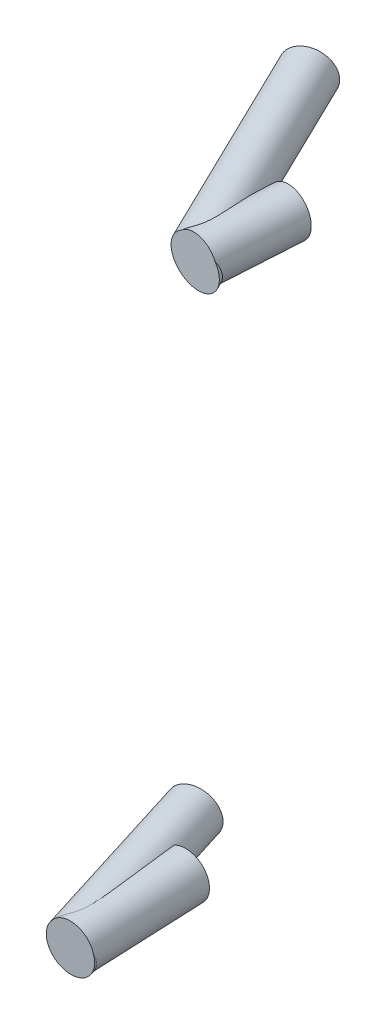
ISO-10303-21;
HEADER;
FILE_DESCRIPTION(('STEP AP214'),'2;1');
FILE_NAME('part.step','',(''),(''),'','','');
FILE_SCHEMA(('AUTOMOTIVE_DESIGN { 1 0 10303 214 1 1 1 1 }'));
ENDSEC;
DATA;
#1=APPLICATION_CONTEXT('core data for automotive mechanical design processes');
#2=APPLICATION_PROTOCOL_DEFINITION('international standard','automotive_design',2000,#1);
#3=PRODUCT_CONTEXT('',#1,'mechanical');
#4=PRODUCT('Part','Part','',(#3));
#5=PRODUCT_RELATED_PRODUCT_CATEGORY('part','',(#4));
#6=PRODUCT_DEFINITION_FORMATION('','',#4);
#7=PRODUCT_DEFINITION_CONTEXT('part definition',#1,'design');
#8=PRODUCT_DEFINITION('design','',#6,#7);
#9=PRODUCT_DEFINITION_SHAPE('','',#8);
#10=(LENGTH_UNIT() NAMED_UNIT(*) SI_UNIT(.MILLI.,.METRE.));
#11=(NAMED_UNIT(*) PLANE_ANGLE_UNIT() SI_UNIT($,.RADIAN.));
#12=(NAMED_UNIT(*) SI_UNIT($,.STERADIAN.) SOLID_ANGLE_UNIT());
#13=UNCERTAINTY_MEASURE_WITH_UNIT(LENGTH_MEASURE(1.E-05),#10,'distance_accuracy_value','');
#14=(GEOMETRIC_REPRESENTATION_CONTEXT(3) GLOBAL_UNCERTAINTY_ASSIGNED_CONTEXT((#13)) GLOBAL_UNIT_ASSIGNED_CONTEXT((#10,
#11,#12)) REPRESENTATION_CONTEXT('',''));
#15=CARTESIAN_POINT('',(0.,0.,0.));
#16=DIRECTION('',(0.,0.,1.));
#17=DIRECTION('',(1.,0.,0.));
#18=AXIS2_PLACEMENT_3D('',#15,#16,#17);
#19=CARTESIAN_POINT('',(-320.393147,904.551348,-269.719394));
#20=DIRECTION('',(-0.0159019479525123,0.028637862758801,-0.999463356440807));
#21=DIRECTION('',(0.,0.999589748535364,0.0286414843017364));
#22=AXIS2_PLACEMENT_3D('',#19,#20,#21);
#23=PLANE('',#22);
#24=CARTESIAN_POINT('',(-320.393147,904.551348,-269.719394));
#25=DIRECTION('',(-0.0159019479525123,0.028637862758801,-0.999463356440807));
#26=DIRECTION('',(0.,0.999589748535364,0.0286414843017364));
#27=AXIS2_PLACEMENT_3D('',#24,#25,#26);
#28=CIRCLE('',#27,6.99999999999999);
#29=CARTESIAN_POINT('',(-325.891411369871,908.878514562351,-269.507926601397));
#30=VERTEX_POINT('',#29);
#31=CARTESIAN_POINT('',(-313.615616191755,906.301132907355,-269.777090804744));
#32=VERTEX_POINT('',#31);
#33=EDGE_CURVE('E107',#30,#32,#28,.T.);
#34=ORIENTED_EDGE('',*,*,#33,.F.);
#35=CARTESIAN_POINT('',(-320.463788052915,904.215779016331,-269.727885204904));
#36=DIRECTION('',(-0.0159019479525123,0.028637862758801,-0.999463356440807));
#37=DIRECTION('',(-0.978436853140769,0.205428982749971,0.02145361187077));
#38=AXIS2_PLACEMENT_3D('',#35,#36,#37);
#39=ELLIPSE('',#38,7.20898734497032,7.00000000000002);
#40=EDGE_CURVE('E118',#30,#32,#39,.F.);
#41=ORIENTED_EDGE('',*,*,#40,.T.);
#42=EDGE_LOOP('',(#34,#41));
#43=FACE_BOUND('',#42,.T.);
#44=ADVANCED_FACE('F77',(#43),#23,.F.);
#45=CARTESIAN_POINT('',(-320.956942,905.566688,-305.154829));
#46=DIRECTION('',(-0.0159019479525123,0.028637862758801,-0.999463356440807));
#47=DIRECTION('',(0.,0.999589748535364,0.0286414843017364));
#48=AXIS2_PLACEMENT_3D('',#45,#46,#47);
#49=PLANE('',#48);
#50=CARTESIAN_POINT('',(-329.567373473225,907.024101826934,-304.976073221569));
#51=DIRECTION('',(-0.0159019479525123,0.028637862758801,-0.999463356440807));
#52=DIRECTION('',(-0.978436853140769,0.205428982749971,0.02145361187077));
#53=AXIS2_PLACEMENT_3D('',#50,#51,#52);
#54=ELLIPSE('',#53,7.20898734497032,7.00000000000002);
#55=CARTESIAN_POINT('',(-324.282017233494,911.722279346482,-304.925547804242));
#56=VERTEX_POINT('',#55);
#57=CARTESIAN_POINT('',(-326.117200818743,900.837113418917,-305.208244405637));
#58=VERTEX_POINT('',#57);
#59=EDGE_CURVE('E102',#56,#58,#54,.T.);
#60=ORIENTED_EDGE('',*,*,#59,.F.);
#61=CARTESIAN_POINT('',(-320.956942,905.566688,-305.154829));
#62=DIRECTION('',(-0.0159019479525123,0.028637862758801,-0.999463356440807));
#63=DIRECTION('',(0.,0.999589748535364,0.0286414843017364));
#64=AXIS2_PLACEMENT_3D('',#61,#62,#63);
#65=CIRCLE('',#64,6.99999999999999);
#66=EDGE_CURVE('E113',#56,#58,#65,.T.);
#67=ORIENTED_EDGE('',*,*,#66,.T.);
#68=EDGE_LOOP('',(#60,#67));
#69=FACE_BOUND('',#68,.T.);
#70=ADVANCED_FACE('F140',(#69),#49,.T.);
#71=CARTESIAN_POINT('',(-320.393147,904.551348,-269.719394));
#72=DIRECTION('',(-0.0159019479525108,0.0286378627588042,-0.999463356440807));
#73=DIRECTION('',(0.,0.999589748535364,0.0286414843017397));
#74=AXIS2_PLACEMENT_3D('',#71,#72,#73);
#75=CYLINDRICAL_SURFACE('',#74,6.99999999999999);
#76=CARTESIAN_POINT('',(-325.891411369872,908.87851456235,-269.507926601397));
#77=CARTESIAN_POINT('',(-325.78222275641,909.020002723451,-269.562705319743));
#78=CARTESIAN_POINT('',(-325.668148605734,909.156704422388,-269.620143119352));
#79=CARTESIAN_POINT('',(-325.431667026022,909.41982577985,-269.74138346599));
#80=CARTESIAN_POINT('',(-325.309255150367,909.54623987173,-269.805189417812));
#81=CARTESIAN_POINT('',(-325.056703142819,909.788838921486,-269.940667376703));
#82=CARTESIAN_POINT('',(-324.926511471945,909.904939095477,-270.012395333179));
#83=CARTESIAN_POINT('',(-324.661231304275,910.125124122657,-270.164621952738));
#84=CARTESIAN_POINT('',(-324.526144274796,910.229212537701,-270.245118001979));
#85=CARTESIAN_POINT('',(-324.276107691959,910.408611328373,-270.402205441371));
#86=CARTESIAN_POINT('',(-324.161538610014,910.485830402986,-270.477226085438));
#87=CARTESIAN_POINT('',(-323.93237848116,910.63133779659,-270.635431752658));
#88=CARTESIAN_POINT('',(-323.817787444727,910.699628088725,-270.718614964855));
#89=CARTESIAN_POINT('',(-323.591063203978,910.82694545147,-270.893775047421));
#90=CARTESIAN_POINT('',(-323.478921777898,910.886009761227,-270.98571402103));
#91=CARTESIAN_POINT('',(-323.25892154541,910.995317068926,-271.179469314458));
#92=CARTESIAN_POINT('',(-323.151062531318,911.045560495061,-271.281285154448));
#93=CARTESIAN_POINT('',(-322.940882377167,911.138119147737,-271.496422769685));
#94=CARTESIAN_POINT('',(-322.838639468462,911.180336236543,-271.609863719419));
#95=CARTESIAN_POINT('',(-322.64345884017,911.25680286404,-271.846965218668));
#96=CARTESIAN_POINT('',(-322.550519944245,911.291053410695,-271.970624472629));
#97=CARTESIAN_POINT('',(-322.375752967364,911.352586822136,-272.227068697095));
#98=CARTESIAN_POINT('',(-322.293918932118,911.37987342787,-272.359848719168));
#99=CARTESIAN_POINT('',(-322.142092854565,911.42871474349,-272.633005592112));
#100=CARTESIAN_POINT('',(-322.072103389374,911.450268206553,-272.773384087496));
#101=CARTESIAN_POINT('',(-321.928668394241,911.493436132761,-273.093747819377));
#102=CARTESIAN_POINT('',(-321.858301744647,911.513865788417,-273.275264988175));
#103=CARTESIAN_POINT('',(-321.733586998638,911.549910641377,-273.644143915747));
#104=CARTESIAN_POINT('',(-321.679246235869,911.565523634667,-273.831508307049));
#105=CARTESIAN_POINT('',(-321.583766620749,911.593563604376,-274.21099928772));
#106=CARTESIAN_POINT('',(-321.542712774892,911.605969967725,-274.403148386598));
#107=CARTESIAN_POINT('',(-321.489501717067,911.622901573725,-274.692920926957));
#108=CARTESIAN_POINT('',(-321.473160582766,911.628265438562,-274.789762429977));
#109=CARTESIAN_POINT('',(-321.442983516001,911.63852951301,-274.983858262492));
#110=CARTESIAN_POINT('',(-321.429147512759,911.643429735718,-275.081112580246));
#111=CARTESIAN_POINT('',(-321.391553568756,911.657357147062,-275.369087652372));
#112=CARTESIAN_POINT('',(-321.370960712532,911.665849565064,-275.560248809157));
#113=CARTESIAN_POINT('',(-321.336679428983,911.681830565214,-275.943244049682));
#114=CARTESIAN_POINT('',(-321.322992464978,911.689318934363,-276.135078267376));
#115=CARTESIAN_POINT('',(-321.301208891701,911.703578774231,-276.519218900161));
#116=CARTESIAN_POINT('',(-321.293116272429,911.710349730369,-276.711525554305));
#117=CARTESIAN_POINT('',(-321.281513505583,911.723353338687,-277.096300088573));
#118=CARTESIAN_POINT('',(-321.278003688521,911.729585952012,-277.288767979326));
#119=CARTESIAN_POINT('',(-321.273082249875,911.747699939775,-277.867264459023));
#120=CARTESIAN_POINT('',(-321.277327414894,911.758960895797,-278.253358745855));
#121=CARTESIAN_POINT('',(-321.296247303604,911.780356499911,-279.025119447575));
#122=CARTESIAN_POINT('',(-321.310917918371,911.790491589914,-279.410785971097));
#123=CARTESIAN_POINT('',(-321.347941999708,911.809917183376,-280.1845571358));
#124=CARTESIAN_POINT('',(-321.370350225029,911.81920105352,-280.572659253647));
#125=CARTESIAN_POINT('',(-321.420879559666,911.836925073926,-281.348535649667));
#126=CARTESIAN_POINT('',(-321.449001177929,911.845365148922,-281.736309895541));
#127=CARTESIAN_POINT('',(-321.539736810245,911.869424714517,-282.897778908693));
#128=CARTESIAN_POINT('',(-321.608798096654,911.883817713124,-283.670991669127));
#129=CARTESIAN_POINT('',(-321.766817705182,911.910760094472,-285.311640813877));
#130=CARTESIAN_POINT('',(-321.857179245834,911.922863635067,-286.178945102976));
#131=CARTESIAN_POINT('',(-322.046813833081,911.942394218237,-287.912653909698));
#132=CARTESIAN_POINT('',(-322.146087186401,911.949821099781,-288.779058395313));
#133=CARTESIAN_POINT('',(-322.351044377227,911.959586373418,-290.511820817372));
#134=CARTESIAN_POINT('',(-322.456733173258,911.961920776686,-291.378178186191));
#135=CARTESIAN_POINT('',(-322.672927396413,911.96103889063,-293.110276942433));
#136=CARTESIAN_POINT('',(-322.783432763117,911.957822670914,-293.976018337446));
#137=CARTESIAN_POINT('',(-323.005249149435,911.945509483134,-295.683271366173));
#138=CARTESIAN_POINT('',(-323.116455386108,911.936575836982,-296.524797793218));
#139=CARTESIAN_POINT('',(-323.342004071417,911.912445768469,-298.207340604675));
#140=CARTESIAN_POINT('',(-323.456346518281,911.897249349644,-299.048356989374));
#141=CARTESIAN_POINT('',(-323.687723316841,911.859983579668,-300.729093464017));
#142=CARTESIAN_POINT('',(-323.804755137392,911.837920464112,-301.568814038191));
#143=CARTESIAN_POINT('',(-324.041451713547,911.786087397766,-303.247653397277));
#144=CARTESIAN_POINT('',(-324.161116495447,911.756317369977,-304.086772176092));
#145=CARTESIAN_POINT('',(-324.282017233493,911.722279346481,-304.925547804242));
#146=B_SPLINE_CURVE_WITH_KNOTS('',3,(#76,#77,#78,#79,#80,#81,#82,#83,#84,#85,#86,#87,#88,#89,
#90,#91,#92,#93,#94,#95,#96,#97,#98,#99,#100,#101,#102,#103,#104,#105,#106,#107,#108,#109,#110,
#111,#112,#113,#114,#115,#116,#117,#118,#119,#120,#121,#122,#123,#124,#125,#126,#127,#128,#129,
#130,#131,#132,#133,#134,#135,#136,#137,#138,#139,#140,#141,#142,#143,#144,#145),.UNSPECIFIED.,
.F.,.F.,(4,2,2,2,2,2,2,2,2,2,2,2,2,2,2,2,2,2,2,2,2,2,2,2,2,2,2,2,2,2,2,2,2,2,4),(0.,
0.560657118605184,1.12161562023885,1.68682543673299,2.25186721811876,2.72309299133645,
3.19421445325709,3.66338222877233,4.13252722306136,4.60708384366297,5.0815803884754,
5.55582150020635,6.03016566404197,6.61639695540475,7.20289609873614,7.79307657199018,
8.08812152006256,8.38315813076993,8.96034314582646,9.53765041196917,10.1153690018346,
10.6931292546662,11.8517340391028,13.0098824423566,14.1764009425718,15.3430234015918,
17.6721466357314,20.2883251268245,22.9045936957899,25.5229107943133,28.1411950574141,
30.687835682247,33.234474869228,35.7788081870409,38.3231669260481),.UNSPECIFIED.);
#147=EDGE_CURVE('E13',#30,#56,#146,.T.);
#148=ORIENTED_EDGE('',*,*,#147,.F.);
#149=ORIENTED_EDGE('',*,*,#33,.T.);
#150=CARTESIAN_POINT('',(-326.117200818743,900.837113418916,-305.208244405637));
#151=CARTESIAN_POINT('',(-326.045132141136,900.752027270469,-304.635432414721));
#152=CARTESIAN_POINT('',(-325.972416143778,900.668953467234,-304.062405143649));
#153=CARTESIAN_POINT('',(-325.825666672854,900.506541405216,-302.915993364264));
#154=CARTESIAN_POINT('',(-325.751633207368,900.427203123531,-302.342608858162));
#155=CARTESIAN_POINT('',(-325.602225258607,900.271972107609,-301.195550274783));
#156=CARTESIAN_POINT('',(-325.526850778533,900.196079365146,-300.6218761982));
#157=CARTESIAN_POINT('',(-325.37469702915,900.047504670049,-299.474298453538));
#158=CARTESIAN_POINT('',(-325.297917757471,899.974822722834,-298.900394785072));
#159=CARTESIAN_POINT('',(-325.065336100913,899.761268821825,-297.178380336702));
#160=CARTESIAN_POINT('',(-324.907295741319,899.624894883109,-296.030011262742));
#161=CARTESIAN_POINT('',(-324.583984798906,899.362760254852,-293.7330885223));
#162=CARTESIAN_POINT('',(-324.41871427309,899.236999481657,-292.584534857344));
#163=CARTESIAN_POINT('',(-324.161427357067,899.054051490236,-290.84853046016));
#164=CARTESIAN_POINT('',(-324.073040928008,898.993361730146,-290.260908538157));
#165=CARTESIAN_POINT('',(-323.89309659318,898.874332756105,-289.085906966228));
#166=CARTESIAN_POINT('',(-323.801538668594,898.815993556106,-288.498527317761));
#167=CARTESIAN_POINT('',(-323.614429520297,898.701535147998,-287.324158872603));
#168=CARTESIAN_POINT('',(-323.518878117637,898.645416039591,-286.737170094627));
#169=CARTESIAN_POINT('',(-323.322566190033,898.535285144586,-285.563878392587));
#170=CARTESIAN_POINT('',(-323.221805812241,898.481273298534,-284.977575449625));
#171=CARTESIAN_POINT('',(-323.029542593611,898.383583825266,-283.897990377446));
#172=CARTESIAN_POINT('',(-322.939069122081,898.339614815073,-283.404552343897));
#173=CARTESIAN_POINT('',(-322.751275530039,898.253088311002,-282.418799281279));
#174=CARTESIAN_POINT('',(-322.653954733642,898.210530957077,-281.926484368037));
#175=CARTESIAN_POINT('',(-322.449712741189,898.126874095589,-280.943447420855));
#176=CARTESIAN_POINT('',(-322.342787096924,898.085775275925,-280.452726235149));
#177=CARTESIAN_POINT('',(-322.171796614055,898.025478489805,-279.719042576581));
#178=CARTESIAN_POINT('',(-322.113038161101,898.005606413145,-279.474901437877));
#179=CARTESIAN_POINT('',(-321.991105120831,897.966406266838,-278.9876841975));
#180=CARTESIAN_POINT('',(-321.92793070515,897.947078176088,-278.744608054824));
#181=CARTESIAN_POINT('',(-321.790505652206,897.907518623044,-278.239503131727));
#182=CARTESIAN_POINT('',(-321.715770311374,897.887347964312,-277.977600349737));
#183=CARTESIAN_POINT('',(-321.55783573424,897.848157945963,-277.456176621014));
#184=CARTESIAN_POINT('',(-321.474634604917,897.829138845369,-277.196656221208));
#185=CARTESIAN_POINT('',(-321.297092547988,897.792884623084,-276.681325869931));
#186=CARTESIAN_POINT('',(-321.202753159871,897.77564925547,-276.425515411161));
#187=CARTESIAN_POINT('',(-320.999236161367,897.744089893717,-275.919673811754));
#188=CARTESIAN_POINT('',(-320.890065992505,897.729764448427,-275.669639845844));
#189=CARTESIAN_POINT('',(-320.699152751495,897.710833072001,-275.276057674478));
#190=CARTESIAN_POINT('',(-320.623674222335,897.704624838903,-275.129559807129));
#191=CARTESIAN_POINT('',(-320.464313873641,897.694803937305,-274.84114240381));
#192=CARTESIAN_POINT('',(-320.380435032578,897.691190352517,-274.699221268514));
#193=CARTESIAN_POINT('',(-320.203315280915,897.68756820395,-274.421777364486));
#194=CARTESIAN_POINT('',(-320.110101099432,897.68754962633,-274.286237874126));
#195=CARTESIAN_POINT('',(-319.913396535808,897.692373866636,-274.022999449708));
#196=CARTESIAN_POINT('',(-319.809909246214,897.697215225535,-273.895298174707));
#197=CARTESIAN_POINT('',(-319.519030888344,897.718759591706,-273.567075236982));
#198=CARTESIAN_POINT('',(-319.32192438532,897.741240988987,-273.37516912064));
#199=CARTESIAN_POINT('',(-319.008325180329,897.793740837064,-273.113022303517));
#200=CARTESIAN_POINT('',(-318.900743811639,897.814385465652,-273.029890234286));
#201=CARTESIAN_POINT('',(-318.680924968517,897.862610819769,-272.872167091233));
#202=CARTESIAN_POINT('',(-318.568687156514,897.890192048907,-272.797576638119));
#203=CARTESIAN_POINT('',(-318.341671682071,897.952582264352,-272.657049221994));
#204=CARTESIAN_POINT('',(-318.226908840082,897.987355832483,-272.591072346025));
#205=CARTESIAN_POINT('',(-317.995848806988,898.064422154114,-272.466661504244));
#206=CARTESIAN_POINT('',(-317.879551612925,898.106714922115,-272.408227552978));
#207=CARTESIAN_POINT('',(-317.646638997041,898.198921424413,-272.297931154309));
#208=CARTESIAN_POINT('',(-317.530023359538,898.248846492936,-272.246078693778));
#209=CARTESIAN_POINT('',(-317.29783388824,898.356176463164,-272.148066366885));
#210=CARTESIAN_POINT('',(-317.182260302734,898.41358309965,-272.101907825641));
#211=CARTESIAN_POINT('',(-316.907045293234,898.560288171492,-271.996694400434));
#212=CARTESIAN_POINT('',(-316.748400042245,898.653119944933,-271.939931582837));
#213=CARTESIAN_POINT('',(-316.437456188307,898.852438799248,-271.833374171942));
#214=CARTESIAN_POINT('',(-316.285159510969,898.958929983852,-271.783581682195));
#215=CARTESIAN_POINT('',(-315.988637630826,899.18476697189,-271.688987505085));
#216=CARTESIAN_POINT('',(-315.844416877547,899.30411975771,-271.644188555764));
#217=CARTESIAN_POINT('',(-315.565581420814,899.554695840697,-271.558019992629));
#218=CARTESIAN_POINT('',(-315.430967200493,899.685919734133,-271.516650551273));
#219=CARTESIAN_POINT('',(-315.171356588714,899.96048661527,-271.435690658513));
#220=CARTESIAN_POINT('',(-315.046460604138,900.103930415936,-271.396120186475));
#221=CARTESIAN_POINT('',(-314.808723142192,900.40077090888,-271.318110686257));
#222=CARTESIAN_POINT('',(-314.695881852078,900.554167755707,-271.279671675659));
#223=CARTESIAN_POINT('',(-314.483175761485,900.869688000209,-271.203076865615));
#224=CARTESIAN_POINT('',(-314.383306057411,901.03180806731,-271.16492096432));
#225=CARTESIAN_POINT('',(-314.197228576359,901.363608045559,-271.08816337454));
#226=CARTESIAN_POINT('',(-314.11102103651,901.533288087855,-271.04956167833));
#227=CARTESIAN_POINT('',(-313.949019525056,901.887356529965,-270.96940104387));
#228=CARTESIAN_POINT('',(-313.873936542387,902.072058857075,-270.927789613227));
#229=CARTESIAN_POINT('',(-313.73999521723,902.446868499119,-270.842802693975));
#230=CARTESIAN_POINT('',(-313.681137577215,902.636976047679,-270.799427129082));
#231=CARTESIAN_POINT('',(-313.580002042016,903.021117426825,-270.710347164301));
#232=CARTESIAN_POINT('',(-313.537731889469,903.215153046608,-270.664641688086));
#233=CARTESIAN_POINT('',(-313.470022129673,903.605457877514,-270.570406824355));
#234=CARTESIAN_POINT('',(-313.444582162265,903.801727040748,-270.521877497292));
#235=CARTESIAN_POINT('',(-313.410710525301,904.193251862528,-270.421896734942));
#236=CARTESIAN_POINT('',(-313.402140498109,904.388502554636,-270.370472658622));
#237=CARTESIAN_POINT('',(-313.401448643956,904.777992734867,-270.263814403508));
#238=CARTESIAN_POINT('',(-313.40932700974,904.972232211112,-270.208580180076));
#239=CARTESIAN_POINT('',(-313.44122960526,905.358216552171,-270.093682155162));
#240=CARTESIAN_POINT('',(-313.465265918186,905.549959440526,-270.034015068435));
#241=CARTESIAN_POINT('',(-313.528909283347,905.929169387119,-269.909566862359));
#242=CARTESIAN_POINT('',(-313.568517571037,906.116636104844,-269.844785337565));
#243=CARTESIAN_POINT('',(-313.615616191754,906.301132907353,-269.777090804745));
#244=B_SPLINE_CURVE_WITH_KNOTS('',3,(#150,#151,#152,#153,#154,#155,#156,#157,#158,#159,#160,
#161,#162,#163,#164,#165,#166,#167,#168,#169,#170,#171,#172,#173,#174,#175,#176,#177,#178,#179,
#180,#181,#182,#183,#184,#185,#186,#187,#188,#189,#190,#191,#192,#193,#194,#195,#196,#197,#198,
#199,#200,#201,#202,#203,#204,#205,#206,#207,#208,#209,#210,#211,#212,#213,#214,#215,#216,#217,
#218,#219,#220,#221,#222,#223,#224,#225,#226,#227,#228,#229,#230,#231,#232,#233,#234,#235,#236,
#237,#238,#239,#240,#241,#242,#243),.UNSPECIFIED.,.F.,.F.,(4,2,2,2,2,2,2,2,2,2,2,2,2,2,2,2,2,2,
2,2,2,2,2,2,2,2,2,2,2,2,2,2,2,2,2,2,2,2,2,2,2,2,2,2,2,2,4),(0.,1.75068541424331,
3.50136009358401,5.252030592648,7.00270404577523,10.5041887392605,14.0056458312002,
15.7976050026467,17.5895748081047,19.3816249989892,21.1736245927336,22.6843475132716,
24.1952197637901,25.7067953750529,26.4624563212527,27.2180879137011,28.0372916765121,
28.8566790243382,29.675953251628,30.4948179060557,30.9893283376418,31.4836640489099,
31.9766227751818,32.4694335518666,33.2928287146576,33.704939373402,34.1170799607404,
34.5272373519344,34.9373955340838,35.348168840456,35.7590375645151,36.3353634289396,
36.9118628475797,37.488676831723,38.0655198045032,38.6476949555251,39.2298791486787,
39.811842616615,40.3938161843248,41.0041130076819,41.6144362495908,42.2250440376767,
42.8356387585478,43.4412045134367,44.0467773644444,44.6528035777205,45.2588778818125),.UNSPECIFIED.);
#245=EDGE_CURVE('E90',#58,#32,#244,.T.);
#246=ORIENTED_EDGE('',*,*,#245,.F.);
#247=ORIENTED_EDGE('',*,*,#66,.F.);
#248=EDGE_LOOP('',(#148,#149,#246,#247));
#249=FACE_BOUND('',#248,.T.);
#250=ADVANCED_FACE('F109',(#249),#75,.T.);
#251=CARTESIAN_POINT('',(-333.563058000003,908.256711999999,-320.446970999999));
#252=DIRECTION('',(-0.249324729269208,0.0769130284527394,-0.965360847263377));
#253=DIRECTION('',(-0.968228929450566,0.,0.250065471776914));
#254=AXIS2_PLACEMENT_3D('',#251,#252,#253);
#255=PLANE('',#254);
#256=CARTESIAN_POINT('',(-333.563058000003,908.256711999999,-320.446970999999));
#257=DIRECTION('',(-0.249324729269208,0.0769130284527394,-0.965360847263377));
#258=DIRECTION('',(-0.968228929450566,0.,0.250065471776914));
#259=AXIS2_PLACEMENT_3D('',#256,#257,#258);
#260=CIRCLE('',#259,7.00000000000002);
#261=CARTESIAN_POINT('',(-340.340660506157,908.256711999999,-318.696512697561));
#262=VERTEX_POINT('',#261);
#263=EDGE_CURVE('E119',#262,#262,#260,.T.);
#264=ORIENTED_EDGE('',*,*,#263,.T.);
#265=EDGE_LOOP('',(#264));
#266=FACE_BOUND('',#265,.T.);
#267=ADVANCED_FACE('F133',(#266),#255,.T.);
#268=CARTESIAN_POINT('',(-319.777261844631,904.003995732956,-267.069723200516));
#269=DIRECTION('',(-0.249324729269209,0.076913028452731,-0.965360847263377));
#270=DIRECTION('',(-0.968228929450566,0.,0.250065471776914));
#271=AXIS2_PLACEMENT_3D('',#268,#269,#270);
#272=CYLINDRICAL_SURFACE('',#271,7.00000000000002);
#273=ORIENTED_EDGE('',*,*,#40,.F.);
#274=ORIENTED_EDGE('',*,*,#147,.T.);
#275=ORIENTED_EDGE('',*,*,#59,.T.);
#276=ORIENTED_EDGE('',*,*,#245,.T.);
#277=EDGE_LOOP('',(#273,#274,#275,#276));
#278=FACE_BOUND('',#277,.T.);
#279=ORIENTED_EDGE('',*,*,#263,.F.);
#280=EDGE_LOOP('',(#279));
#281=FACE_BOUND('',#280,.T.);
#282=ADVANCED_FACE('F116',(#278,#281),#272,.T.);
#283=CLOSED_SHELL('',(#44,#70,#250,#267,#282));
#284=MANIFOLD_SOLID_BREP('B2',#283);
#285=CARTESIAN_POINT('',(-277.415676,1108.70899,-264.553411));
#286=DIRECTION('',(0.0713991617640458,0.0102076867040669,-0.997395589939891));
#287=DIRECTION('',(-0.997447556749249,0.,-0.0714028818392749));
#288=AXIS2_PLACEMENT_3D('',#285,#286,#287);
#289=PLANE('',#288);
#290=CARTESIAN_POINT('',(-277.415676,1108.70899,-264.553411));
#291=DIRECTION('',(0.0713991617640458,0.0102076867040669,-0.997395589939891));
#292=DIRECTION('',(-0.997447556749249,0.,-0.0714028818392749));
#293=AXIS2_PLACEMENT_3D('',#290,#291,#292);
#294=CIRCLE('',#293,6.99999999999999);
#295=CARTESIAN_POINT('',(-282.055919759005,1113.94258466107,-264.83202324066));
#296=VERTEX_POINT('',#295);
#297=CARTESIAN_POINT('',(-271.06317895026,1111.60918135783,-264.068982139379));
#298=VERTEX_POINT('',#297);
#299=EDGE_CURVE('E227',#296,#298,#294,.T.);
#300=ORIENTED_EDGE('',*,*,#299,.F.);
#301=CARTESIAN_POINT('',(-277.571085833223,1107.97073995493,-264.572091608957));
#302=DIRECTION('',(0.0713991617640458,0.0102076867040669,-0.997395589939891));
#303=DIRECTION('',(-0.975957806814221,0.207164341624134,-0.0677443346547487));
#304=AXIS2_PLACEMENT_3D('',#301,#302,#303);
#305=ELLIPSE('',#304,7.90464373989982,7.00000000000002);
#306=EDGE_CURVE('E239',#296,#298,#305,.F.);
#307=ORIENTED_EDGE('',*,*,#306,.T.);
#308=EDGE_LOOP('',(#300,#307));
#309=FACE_BOUND('',#308,.T.);
#310=ADVANCED_FACE('F199',(#309),#289,.F.);
#311=CARTESIAN_POINT('',(-275.513272,1108.98097,-291.128644));
#312=DIRECTION('',(0.0713991617640458,0.0102076867040669,-0.997395589939891));
#313=DIRECTION('',(-0.997447556749249,0.,-0.0714028818392749));
#314=AXIS2_PLACEMENT_3D('',#311,#312,#313);
#315=PLANE('',#314);
#316=CARTESIAN_POINT('',(-289.309556878001,1111.1382374436,-292.094181120135));
#317=DIRECTION('',(0.0713991617640458,0.0102076867040669,-0.997395589939891));
#318=DIRECTION('',(-0.975957806814221,0.207164341624134,-0.0677443346547487));
#319=AXIS2_PLACEMENT_3D('',#316,#317,#318);
#320=ELLIPSE('',#319,7.90464373989982,7.00000000000002);
#321=CARTESIAN_POINT('',(-281.649506636986,1112.32500430262,-291.533686050571));
#322=VERTEX_POINT('',#321);
#323=CARTESIAN_POINT('',(-282.351701872763,1107.57316310219,-291.632585081673));
#324=VERTEX_POINT('',#323);
#325=EDGE_CURVE('E233',#322,#324,#320,.T.);
#326=ORIENTED_EDGE('',*,*,#325,.F.);
#327=CARTESIAN_POINT('',(-275.513272,1108.98097,-291.128644));
#328=DIRECTION('',(0.0713991617640458,0.0102076867040669,-0.997395589939891));
#329=DIRECTION('',(-0.997447556749249,0.,-0.0714028818392749));
#330=AXIS2_PLACEMENT_3D('',#327,#328,#329);
#331=CIRCLE('',#330,6.99999999999999);
#332=EDGE_CURVE('E232',#322,#324,#331,.T.);
#333=ORIENTED_EDGE('',*,*,#332,.T.);
#334=EDGE_LOOP('',(#326,#333));
#335=FACE_BOUND('',#334,.T.);
#336=ADVANCED_FACE('F261',(#335),#315,.T.);
#337=CARTESIAN_POINT('',(-277.415676,1108.70899,-264.553411));
#338=DIRECTION('',(0.0713991617640393,0.0102076867040752,-0.997395589939891));
#339=DIRECTION('',(-0.99744755674925,0.,-0.0714028818392684));
#340=AXIS2_PLACEMENT_3D('',#337,#338,#339);
#341=CYLINDRICAL_SURFACE('',#340,6.99999999999999);
#342=CARTESIAN_POINT('',(-282.055919759005,1113.94258466107,-264.83202324066));
#343=CARTESIAN_POINT('',(-281.945534490894,1114.03668728508,-264.903942080665));
#344=CARTESIAN_POINT('',(-281.833452289442,1114.12634764843,-264.97915151761));
#345=CARTESIAN_POINT('',(-281.607533468358,1114.29661674353,-265.137111542537));
#346=CARTESIAN_POINT('',(-281.493695328103,1114.37721706341,-265.219869011534));
#347=CARTESIAN_POINT('',(-281.265413591329,1114.52949180923,-265.394290887598));
#348=CARTESIAN_POINT('',(-281.150970579768,1114.60110825661,-265.486006970718));
#349=CARTESIAN_POINT('',(-280.924377596783,1114.73471983731,-265.67876748323));
#350=CARTESIAN_POINT('',(-280.812226994947,1114.79671764752,-265.779809304714));
#351=CARTESIAN_POINT('',(-280.591594442656,1114.91172781197,-265.992885445632));
#352=CARTESIAN_POINT('',(-280.483155453821,1114.96465275172,-266.10501189323));
#353=CARTESIAN_POINT('',(-280.273645760295,1115.06116932643,-266.339703361052));
#354=CARTESIAN_POINT('',(-280.172574578081,1115.1047615666,-266.462267703659));
#355=CARTESIAN_POINT('',(-279.980759353693,1115.1830506845,-266.71663098622));
#356=CARTESIAN_POINT('',(-279.889955645956,1115.21780059824,-266.848368525599));
#357=CARTESIAN_POINT('',(-279.719650975437,1115.27972086675,-267.120628439634));
#358=CARTESIAN_POINT('',(-279.640150622651,1115.30689081254,-267.261151287808));
#359=CARTESIAN_POINT('',(-279.487139217527,1115.35680034892,-267.561300346631));
#360=CARTESIAN_POINT('',(-279.414666416388,1115.37898809436,-267.721545499473));
#361=CARTESIAN_POINT('',(-279.28357362343,1115.4173761039,-268.048269074142));
#362=CARTESIAN_POINT('',(-279.224957041855,1115.43357489458,-268.214749018799));
#363=CARTESIAN_POINT('',(-279.120063526011,1115.46142888612,-268.552974356428));
#364=CARTESIAN_POINT('',(-279.073863328413,1115.47305602849,-268.724745495901));
#365=CARTESIAN_POINT('',(-278.992620947133,1115.49273322026,-269.071035519099));
#366=CARTESIAN_POINT('',(-278.957577721477,1115.50078360372,-269.245554144631));
#367=CARTESIAN_POINT('',(-278.883335507087,1115.51714330594,-269.674811729201));
#368=CARTESIAN_POINT('',(-278.849298304942,1115.52395537177,-269.930490046324));
#369=CARTESIAN_POINT('',(-278.796381602838,1115.5335233515,-270.443540369191));
#370=CARTESIAN_POINT('',(-278.777512353168,1115.5362765235,-270.700913401977));
#371=CARTESIAN_POINT('',(-278.751382286615,1115.53867620704,-271.216821778539));
#372=CARTESIAN_POINT('',(-278.744148556552,1115.53831548199,-271.475358433441));
#373=CARTESIAN_POINT('',(-278.738720743439,1115.53502416562,-271.992417473448));
#374=CARTESIAN_POINT('',(-278.740524464393,1115.53209419874,-272.250939846758));
#375=CARTESIAN_POINT('',(-278.751256236356,1115.52394293578,-272.76958484317));
#376=CARTESIAN_POINT('',(-278.76023375086,1115.5187058449,-273.029706090472));
#377=CARTESIAN_POINT('',(-278.783912162785,1115.50610078421,-273.54963828254));
#378=CARTESIAN_POINT('',(-278.798613318957,1115.49873271806,-273.809449212746));
#379=CARTESIAN_POINT('',(-278.83262685219,1115.48195089874,-274.328331465154));
#380=CARTESIAN_POINT('',(-278.85193273562,1115.47254002801,-274.5874033136));
#381=CARTESIAN_POINT('',(-278.894357341828,1115.45168130845,-275.10515485617));
#382=CARTESIAN_POINT('',(-278.917476166375,1115.44023340526,-275.363834539641));
#383=CARTESIAN_POINT('',(-278.987246664501,1115.40500077834,-276.093799414892));
#384=CARTESIAN_POINT('',(-279.037591214865,1115.37882384287,-276.564618643124));
#385=CARTESIAN_POINT('',(-279.146184187456,1115.31927856111,-277.504899101274));
#386=CARTESIAN_POINT('',(-279.204433063775,1115.2859098016,-277.97436025159));
#387=CARTESIAN_POINT('',(-279.327207757758,1115.21138349472,-278.912156072241));
#388=CARTESIAN_POINT('',(-279.391737660961,1115.17022086109,-279.380489803566));
#389=CARTESIAN_POINT('',(-279.525927656544,1115.07935180928,-280.315577504178));
#390=CARTESIAN_POINT('',(-279.595587588704,1115.02964565786,-280.782331522325));
#391=CARTESIAN_POINT('',(-279.738592904395,1114.92122390497,-281.709415016522));
#392=CARTESIAN_POINT('',(-279.811894725635,1114.86260285978,-282.169762209468));
#393=CARTESIAN_POINT('',(-279.962356771006,1114.73471696873,-283.088377770379));
#394=CARTESIAN_POINT('',(-280.039517190176,1114.66545158447,-283.546646031981));
#395=CARTESIAN_POINT('',(-280.197413286595,1114.51458430017,-284.460484886679));
#396=CARTESIAN_POINT('',(-280.278148496007,1114.43298401106,-284.916055823981));
#397=CARTESIAN_POINT('',(-280.443079921962,1114.2551043258,-285.823659196399));
#398=CARTESIAN_POINT('',(-280.527275708779,1114.15882674825,-286.275692062613));
#399=CARTESIAN_POINT('',(-280.692595751462,1113.9562816492,-287.14051673103));
#400=CARTESIAN_POINT('',(-280.77346171047,1113.85134314456,-287.553663435556));
#401=CARTESIAN_POINT('',(-280.897058130661,1113.67943552828,-288.168605588187));
#402=CARTESIAN_POINT('',(-280.938616276192,1113.6197532872,-288.372678646355));
#403=CARTESIAN_POINT('',(-281.022551173836,1113.49481768827,-288.778983416911));
#404=CARTESIAN_POINT('',(-281.064928032983,1113.42956359813,-288.981214883385));
#405=CARTESIAN_POINT('',(-281.15095077261,1113.29194346221,-289.385291649673));
#406=CARTESIAN_POINT('',(-281.194605026772,1113.21951389104,-289.587113671665));
#407=CARTESIAN_POINT('',(-281.282806252971,1113.066926721,-289.987547438298));
#408=CARTESIAN_POINT('',(-281.327352900589,1112.98677189157,-290.186160303802));
#409=CARTESIAN_POINT('',(-281.417561250464,1112.81682089543,-290.579881096214));
#410=CARTESIAN_POINT('',(-281.463226310399,1112.72699195822,-290.774974318667));
#411=CARTESIAN_POINT('',(-281.532486490877,1112.58347501413,-291.063213402735));
#412=CARTESIAN_POINT('',(-281.555714836281,1112.5341407321,-291.158616954355));
#413=CARTESIAN_POINT('',(-281.602423475837,1112.43215533252,-291.347606481834));
#414=CARTESIAN_POINT('',(-281.625903842748,1112.37950323448,-291.441191909606));
#415=CARTESIAN_POINT('',(-281.649506636986,1112.32500430262,-291.533686050571));
#416=B_SPLINE_CURVE_WITH_KNOTS('',3,(#342,#343,#344,#345,#346,#347,#348,#349,#350,#351,#352,
#353,#354,#355,#356,#357,#358,#359,#360,#361,#362,#363,#364,#365,#366,#367,#368,#369,#370,#371,
#372,#373,#374,#375,#376,#377,#378,#379,#380,#381,#382,#383,#384,#385,#386,#387,#388,#389,#390,
#391,#392,#393,#394,#395,#396,#397,#398,#399,#400,#401,#402,#403,#404,#405,#406,#407,#408,#409,
#410,#411,#412,#413,#414,#415),.UNSPECIFIED.,.F.,.F.,(4,2,2,2,2,2,2,2,2,2,2,2,2,2,2,2,2,2,2,2,2,
2,2,2,2,2,2,2,2,2,2,2,2,2,2,2,4),(0.,0.48566413529341,0.971775528616543,1.46087826194255,
1.94984463161165,2.44328537949515,2.93669411803816,3.42706967387779,3.91747168324213,
4.4484096947783,4.97947824317443,5.51375716335233,6.04798617136094,6.82135854803325,
7.59525312053091,8.37094668121783,9.14645176645246,9.92735060182165,10.708284743865,
11.4881240494633,12.2679841726277,13.6905059825898,15.1131095491713,16.5366447224535,
17.9601354552691,19.3694637065309,20.7788632665097,22.188078918885,23.5971201048251,
24.8982929530264,25.5481622553014,26.1981171007344,26.85445211608,27.5105527094089,
28.1689502124388,28.4985546174542,28.8282568887961),.UNSPECIFIED.);
#417=EDGE_CURVE('E75',#296,#322,#416,.T.);
#418=ORIENTED_EDGE('',*,*,#417,.F.);
#419=ORIENTED_EDGE('',*,*,#299,.T.);
#420=CARTESIAN_POINT('',(-282.351701872763,1107.57316310219,-291.632585081673));
#421=CARTESIAN_POINT('',(-282.345152545191,1107.51059853425,-291.546595716533));
#422=CARTESIAN_POINT('',(-282.338145814468,1107.4495918626,-291.459531971709));
#423=CARTESIAN_POINT('',(-282.323320001478,1107.33040408875,-291.283588766995));
#424=CARTESIAN_POINT('',(-282.315501126218,1107.27222227204,-291.194709774408));
#425=CARTESIAN_POINT('',(-282.290992257253,1107.10155619339,-290.925977361483));
#426=CARTESIAN_POINT('',(-282.273235365067,1106.99281682583,-290.743840494783));
#427=CARTESIAN_POINT('',(-282.235499007231,1106.78390363162,-290.375768618599));
#428=CARTESIAN_POINT('',(-282.215526798493,1106.68370363394,-290.189847549348));
#429=CARTESIAN_POINT('',(-282.173683516459,1106.49014108583,-289.814629522295));
#430=CARTESIAN_POINT('',(-282.151811847969,1106.3967806956,-289.625331521206));
#431=CARTESIAN_POINT('',(-282.106590002196,1106.21650767231,-289.245351929296));
#432=CARTESIAN_POINT('',(-282.083249995979,1106.12955815879,-289.054686543353));
#433=CARTESIAN_POINT('',(-282.03516547396,1105.96072375979,-288.671338070017));
#434=CARTESIAN_POINT('',(-282.010421119954,1105.87883829313,-288.478655217136));
#435=CARTESIAN_POINT('',(-281.934249946242,1105.63966075545,-287.897718488991));
#436=CARTESIAN_POINT('',(-281.880931702947,1105.48902838455,-287.506964929711));
#437=CARTESIAN_POINT('',(-281.76931064657,1105.20010385251,-286.715750980195));
#438=CARTESIAN_POINT('',(-281.7109514153,1105.0620004273,-286.315230529955));
#439=CARTESIAN_POINT('',(-281.59028766651,1104.79790322386,-285.510779417573));
#440=CARTESIAN_POINT('',(-281.527982764597,1104.67191062851,-285.106848426505));
#441=CARTESIAN_POINT('',(-281.399635452764,1104.43026172223,-284.296526003442));
#442=CARTESIAN_POINT('',(-281.333593153528,1104.31460510545,-283.890134644629));
#443=CARTESIAN_POINT('',(-281.19778589395,1104.09229702524,-283.075540901204));
#444=CARTESIAN_POINT('',(-281.128021076858,1103.98564521568,-282.667338586834));
#445=CARTESIAN_POINT('',(-280.98429612197,1103.77987176861,-281.847815240728));
#446=CARTESIAN_POINT('',(-280.910318862959,1103.68078535807,-281.436488391083));
#447=CARTESIAN_POINT('',(-280.758107955641,1103.48986083309,-280.612935672979));
#448=CARTESIAN_POINT('',(-280.679874228946,1103.39802285222,-280.200709788096));
#449=CARTESIAN_POINT('',(-280.518602282394,1103.22098751782,-279.375870577756));
#450=CARTESIAN_POINT('',(-280.435565119796,1103.13578871259,-278.963257357074));
#451=CARTESIAN_POINT('',(-280.263804448532,1102.9715260197,-278.138005493424));
#452=CARTESIAN_POINT('',(-280.175081129701,1102.89246192742,-277.725366851764));
#453=CARTESIAN_POINT('',(-279.994115523488,1102.74298741641,-276.916130465203));
#454=CARTESIAN_POINT('',(-279.902132121117,1102.67236309598,-276.51951463241));
#455=CARTESIAN_POINT('',(-279.709925102665,1102.53629004786,-275.727338256382));
#456=CARTESIAN_POINT('',(-279.609700618663,1102.47084186672,-275.331777828841));
#457=CARTESIAN_POINT('',(-279.398476379928,1102.34519755087,-274.542976501687));
#458=CARTESIAN_POINT('',(-279.287484720754,1102.28499753388,-274.149734091617));
#459=CARTESIAN_POINT('',(-279.109778166427,1102.19893265688,-273.562685804815));
#460=CARTESIAN_POINT('',(-279.048678927939,1102.17095259695,-273.367490054323));
#461=CARTESIAN_POINT('',(-278.921989832115,1102.1165302071,-272.978350459478));
#462=CARTESIAN_POINT('',(-278.856400223318,1102.09008779224,-272.784406546486));
#463=CARTESIAN_POINT('',(-278.708186492504,1102.03456646612,-272.365252833083));
#464=CARTESIAN_POINT('',(-278.624564702154,1102.00580673163,-272.140350261307));
#465=CARTESIAN_POINT('',(-278.448083908974,1101.95116422662,-271.69386039786));
#466=CARTESIAN_POINT('',(-278.355226892227,1101.92528084005,-271.472272405111));
#467=CARTESIAN_POINT('',(-278.157915397194,1101.87725828481,-271.034007682641));
#468=CARTESIAN_POINT('',(-278.053467756518,1101.85511692786,-270.817328147192));
#469=CARTESIAN_POINT('',(-277.830001211355,1101.81598108255,-270.391117176514));
#470=CARTESIAN_POINT('',(-277.710989884381,1101.79898393352,-270.181582095967));
#471=CARTESIAN_POINT('',(-277.499093264707,1101.77699271113,-269.843194150419));
#472=CARTESIAN_POINT('',(-277.411254730028,1101.76988124095,-269.711326176216));
#473=CARTESIAN_POINT('',(-277.227141732741,1101.75979619664,-269.453476674257));
#474=CARTESIAN_POINT('',(-277.130870677198,1101.75682095943,-269.327492800354));
#475=CARTESIAN_POINT('',(-276.929673958359,1101.75611479211,-269.083165616784));
#476=CARTESIAN_POINT('',(-276.824773486372,1101.75836908551,-268.964801747736));
#477=CARTESIAN_POINT('',(-276.606162301919,1101.76933840688,-268.736801875429));
#478=CARTESIAN_POINT('',(-276.492452329477,1101.77805289271,-268.62716514063));
#479=CARTESIAN_POINT('',(-276.255895309305,1101.80331130171,-268.416832631354));
#480=CARTESIAN_POINT('',(-276.132972431704,1101.8199280393,-268.316230571765));
#481=CARTESIAN_POINT('',(-275.880490827408,1101.86212682028,-268.125809394663));
#482=CARTESIAN_POINT('',(-275.750931977345,1101.88770903039,-268.035990477721));
#483=CARTESIAN_POINT('',(-275.4869246552,1101.94869304271,-267.866868521166));
#484=CARTESIAN_POINT('',(-275.352465660724,1101.98411720797,-267.787590045575));
#485=CARTESIAN_POINT('',(-275.081138588181,1102.06518101618,-267.639021590223));
#486=CARTESIAN_POINT('',(-274.944270142593,1102.11082223022,-267.569733149345));
#487=CARTESIAN_POINT('',(-274.65434182181,1102.21830741474,-267.432420845933));
#488=CARTESIAN_POINT('',(-274.501242668908,1102.28141575317,-267.365472926618));
#489=CARTESIAN_POINT('',(-274.197145782817,1102.42027639795,-267.240559443844));
#490=CARTESIAN_POINT('',(-274.046148344985,1102.49603046237,-267.182595131492));
#491=CARTESIAN_POINT('',(-273.748207628348,1102.65979613923,-267.073691141722));
#492=CARTESIAN_POINT('',(-273.601267050608,1102.74781569298,-267.022756058256));
#493=CARTESIAN_POINT('',(-273.313207120711,1102.93549749982,-266.926224028341));
#494=CARTESIAN_POINT('',(-273.172087596405,1103.03515940827,-266.880626923956));
#495=CARTESIAN_POINT('',(-272.894789817939,1103.2471777785,-266.792571284632));
#496=CARTESIAN_POINT('',(-272.758729439619,1103.35971452296,-266.750175945069));
#497=CARTESIAN_POINT('',(-272.495235484937,1103.59535720027,-266.668057795982));
#498=CARTESIAN_POINT('',(-272.367801872371,1103.71846308875,-266.628334975243));
#499=CARTESIAN_POINT('',(-272.122618084086,1103.97438228468,-266.550488188367));
#500=CARTESIAN_POINT('',(-272.004865801735,1104.10719346833,-266.512363875288));
#501=CARTESIAN_POINT('',(-271.779903575254,1104.3816500695,-266.436807811283));
#502=CARTESIAN_POINT('',(-271.672693996098,1104.52329579259,-266.39937608437));
#503=CARTESIAN_POINT('',(-271.4584521809,1104.83043482806,-266.320345014475));
#504=CARTESIAN_POINT('',(-271.352726919996,1104.99684045036,-266.278738488876));
#505=CARTESIAN_POINT('',(-271.15609475069,1105.33797465696,-266.194590563392));
#506=CARTESIAN_POINT('',(-271.065188901579,1105.51270383507,-266.152049096925));
#507=CARTESIAN_POINT('',(-270.898904079355,1105.8690458567,-266.065299253069));
#508=CARTESIAN_POINT('',(-270.823527911779,1106.05065993703,-266.021090576192));
#509=CARTESIAN_POINT('',(-270.688872810764,1106.4192021627,-265.930385640877));
#510=CARTESIAN_POINT('',(-270.629593519947,1106.60613018998,-265.883889433252));
#511=CARTESIAN_POINT('',(-270.527618127352,1106.98326984838,-265.788159202124));
#512=CARTESIAN_POINT('',(-270.484883349471,1107.17347272231,-265.738931875242));
#513=CARTESIAN_POINT('',(-270.415980164354,1107.55597140812,-265.63711995269));
#514=CARTESIAN_POINT('',(-270.389811968621,1107.74826724669,-265.584535314168));
#515=CARTESIAN_POINT('',(-270.354023590423,1108.13338997723,-265.475476820123));
#516=CARTESIAN_POINT('',(-270.344410962616,1108.32621707145,-265.419001201282));
#517=CARTESIAN_POINT('',(-270.341544774137,1108.71064360255,-265.301659190488));
#518=CARTESIAN_POINT('',(-270.348290571917,1108.90224308728,-265.240792970818));
#519=CARTESIAN_POINT('',(-270.377709184073,1109.28248186698,-265.114118359112));
#520=CARTESIAN_POINT('',(-270.400376038294,1109.47112224269,-265.048311824748));
#521=CARTESIAN_POINT('',(-270.460978798998,1109.84385128965,-264.911078177757));
#522=CARTESIAN_POINT('',(-270.498914568403,1110.02794000174,-264.839651115594));
#523=CARTESIAN_POINT('',(-270.589060197849,1110.38955905046,-264.690533392877));
#524=CARTESIAN_POINT('',(-270.641243809773,1110.5671007722,-264.612854433677));
#525=CARTESIAN_POINT('',(-270.758701017907,1110.91423778458,-264.4502008788));
#526=CARTESIAN_POINT('',(-270.823966394899,1111.08383798271,-264.365230883125));
#527=CARTESIAN_POINT('',(-270.921486079609,1111.31013196311,-264.242743781026));
#528=CARTESIAN_POINT('',(-270.948799453225,1111.37098179565,-264.2088550845));
#529=CARTESIAN_POINT('',(-271.004901636872,1111.49119638199,-264.139859182273));
#530=CARTESIAN_POINT('',(-271.033688879197,1111.55056261774,-264.104753283597));
#531=CARTESIAN_POINT('',(-271.06317895026,1111.60918135783,-264.068982139379));
#532=B_SPLINE_CURVE_WITH_KNOTS('',3,(#420,#421,#422,#423,#424,#425,#426,#427,#428,#429,#430,
#431,#432,#433,#434,#435,#436,#437,#438,#439,#440,#441,#442,#443,#444,#445,#446,#447,#448,#449,
#450,#451,#452,#453,#454,#455,#456,#457,#458,#459,#460,#461,#462,#463,#464,#465,#466,#467,#468,
#469,#470,#471,#472,#473,#474,#475,#476,#477,#478,#479,#480,#481,#482,#483,#484,#485,#486,#487,
#488,#489,#490,#491,#492,#493,#494,#495,#496,#497,#498,#499,#500,#501,#502,#503,#504,#505,#506,
#507,#508,#509,#510,#511,#512,#513,#514,#515,#516,#517,#518,#519,#520,#521,#522,#523,#524,#525,
#526,#527,#528,#529,#530,#531),.UNSPECIFIED.,.F.,.F.,(4,2,2,2,2,2,2,2,2,2,2,2,2,2,2,2,2,2,2,2,2,
2,2,2,2,2,2,2,2,2,2,2,2,2,2,2,2,2,2,2,2,2,2,2,2,2,2,2,2,2,2,2,2,2,2,4),(0.,0.31958053192269,
0.639079805554753,1.27738463481979,1.91365704103182,2.5501295467367,3.18259649476792,
3.81499072353271,5.08107093257647,6.36383227694974,7.64671878265099,8.92956731562449,
10.2123665180894,11.5008144973202,12.7892862131676,14.0774754013037,15.3656216052443,
16.6051897677336,17.8448886447007,19.0836625438009,19.7029358013965,20.3221748102258,
21.0469952137918,21.771660076541,22.4958996906096,23.2197640709009,23.6952592253792,
24.170563139882,24.6445256777746,25.1184484444689,25.5968253252604,26.0752111027409,
26.5546928933882,27.0342484655681,27.5693468769053,28.104519742175,28.6400407297747,
29.175545868759,29.7197707086718,30.2639932644766,30.8080970837036,31.352219732397,
31.9559717819552,32.5597669687684,33.1636711395895,33.7675619016157,34.3700322988722,
34.9725103875719,35.5752633270562,36.1779926280514,36.7804964134273,37.3829947898481,
37.9843906156217,38.5854097646849,38.8098218826559,39.0340000686716),.UNSPECIFIED.);
#533=EDGE_CURVE('E212',#324,#298,#532,.T.);
#534=ORIENTED_EDGE('',*,*,#533,.F.);
#535=ORIENTED_EDGE('',*,*,#332,.F.);
#536=EDGE_LOOP('',(#418,#419,#534,#535));
#537=FACE_BOUND('',#536,.T.);
#538=ADVANCED_FACE('F228',(#537),#341,.T.);
#539=CARTESIAN_POINT('',(-303.246728000037,1114.89902999997,-324.771356000074));
#540=DIRECTION('',(-0.390137444194902,0.105274304464949,-0.91471858812232));
#541=DIRECTION('',(-0.919829879002764,0.,0.392317465445729));
#542=AXIS2_PLACEMENT_3D('',#539,#540,#541);
#543=PLANE('',#542);
#544=CARTESIAN_POINT('',(-303.246728000037,1114.89902999997,-324.771356000074));
#545=DIRECTION('',(-0.390137444194902,0.105274304464949,-0.91471858812232));
#546=DIRECTION('',(-0.919829879002764,0.,0.392317465445729));
#547=AXIS2_PLACEMENT_3D('',#544,#545,#546);
#548=CIRCLE('',#547,7.00000000000002);
#549=CARTESIAN_POINT('',(-309.685537153056,1114.89902999997,-322.025133741954));
#550=VERTEX_POINT('',#549);
#551=EDGE_CURVE('E240',#550,#550,#548,.T.);
#552=ORIENTED_EDGE('',*,*,#551,.T.);
#553=EDGE_LOOP('',(#552));
#554=FACE_BOUND('',#553,.T.);
#555=ADVANCED_FACE('F254',(#554),#543,.T.);
#556=CARTESIAN_POINT('',(-275.688026224858,1107.46261700112,-260.157058773879));
#557=DIRECTION('',(-0.390137444194901,0.10527430446495,-0.91471858812232));
#558=DIRECTION('',(-0.919829879002764,0.,0.392317465445728));
#559=AXIS2_PLACEMENT_3D('',#556,#557,#558);
#560=CYLINDRICAL_SURFACE('',#559,7.00000000000002);
#561=ORIENTED_EDGE('',*,*,#306,.F.);
#562=ORIENTED_EDGE('',*,*,#417,.T.);
#563=ORIENTED_EDGE('',*,*,#325,.T.);
#564=ORIENTED_EDGE('',*,*,#533,.T.);
#565=EDGE_LOOP('',(#561,#562,#563,#564));
#566=FACE_BOUND('',#565,.T.);
#567=ORIENTED_EDGE('',*,*,#551,.F.);
#568=EDGE_LOOP('',(#567));
#569=FACE_BOUND('',#568,.T.);
#570=ADVANCED_FACE('F237',(#566,#569),#560,.T.);
#571=CLOSED_SHELL('',(#310,#336,#538,#555,#570));
#572=MANIFOLD_SOLID_BREP('B7',#571);
#573=ADVANCED_BREP_SHAPE_REPRESENTATION('',(#18,#284,#572),#14);
#574=SHAPE_DEFINITION_REPRESENTATION(#9,#573);
ENDSEC;
END-ISO-10303-21;
